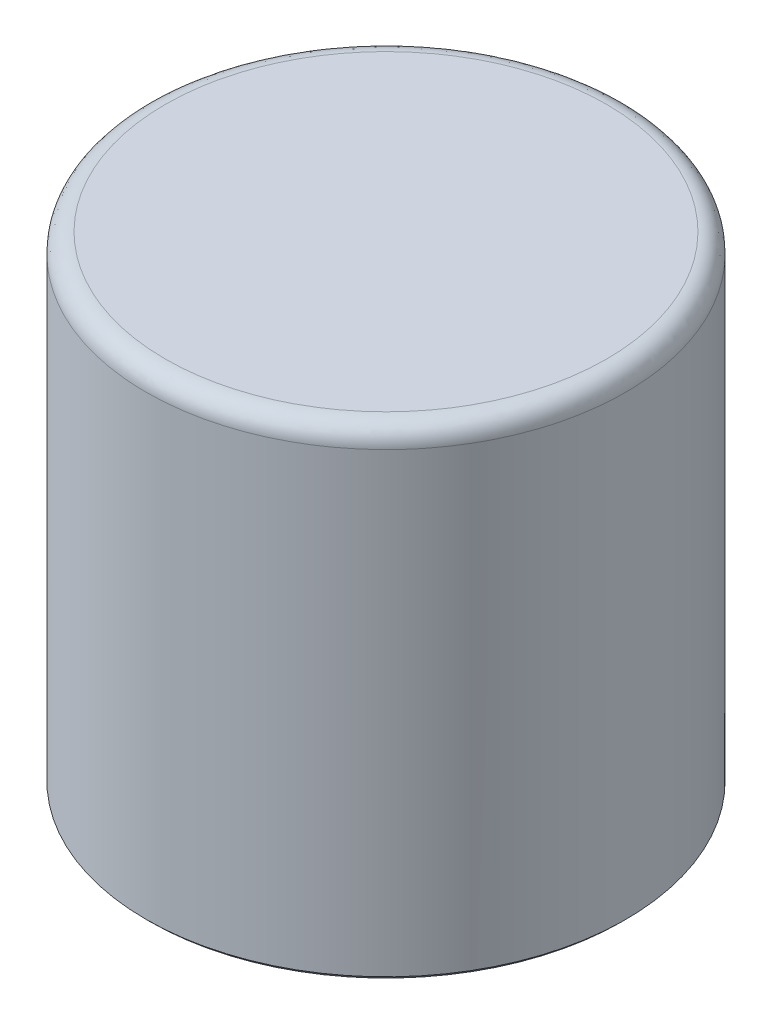
ISO-10303-21;
HEADER;
FILE_DESCRIPTION(('STEP AP214'),'2;1');
FILE_NAME('part.step','',(''),(''),'','','');
FILE_SCHEMA(('AUTOMOTIVE_DESIGN { 1 0 10303 214 1 1 1 1 }'));
ENDSEC;
DATA;
#1=APPLICATION_CONTEXT('core data for automotive mechanical design processes');
#2=APPLICATION_PROTOCOL_DEFINITION('international standard','automotive_design',2000,#1);
#3=PRODUCT_CONTEXT('',#1,'mechanical');
#4=PRODUCT('Part','Part','',(#3));
#5=PRODUCT_RELATED_PRODUCT_CATEGORY('part','',(#4));
#6=PRODUCT_DEFINITION_FORMATION('','',#4);
#7=PRODUCT_DEFINITION_CONTEXT('part definition',#1,'design');
#8=PRODUCT_DEFINITION('design','',#6,#7);
#9=PRODUCT_DEFINITION_SHAPE('','',#8);
#10=(LENGTH_UNIT() NAMED_UNIT(*) SI_UNIT(.MILLI.,.METRE.));
#11=(NAMED_UNIT(*) PLANE_ANGLE_UNIT() SI_UNIT($,.RADIAN.));
#12=(NAMED_UNIT(*) SI_UNIT($,.STERADIAN.) SOLID_ANGLE_UNIT());
#13=UNCERTAINTY_MEASURE_WITH_UNIT(LENGTH_MEASURE(1.E-05),#10,'distance_accuracy_value','');
#14=(GEOMETRIC_REPRESENTATION_CONTEXT(3) GLOBAL_UNCERTAINTY_ASSIGNED_CONTEXT((#13)) GLOBAL_UNIT_ASSIGNED_CONTEXT((#10,
#11,#12)) REPRESENTATION_CONTEXT('',''));
#15=CARTESIAN_POINT('',(0.,0.,0.));
#16=DIRECTION('',(0.,0.,1.));
#17=DIRECTION('',(1.,0.,0.));
#18=AXIS2_PLACEMENT_3D('',#15,#16,#17);
#19=CARTESIAN_POINT('',(0.,25.,0.));
#20=DIRECTION('',(0.,-1.,0.));
#21=DIRECTION('',(0.,0.,-1.));
#22=AXIS2_PLACEMENT_3D('',#19,#20,#21);
#23=CYLINDRICAL_SURFACE('',#22,12.5);
#24=CARTESIAN_POINT('',(0.,24.,12.5));
#25=CARTESIAN_POINT('',(0.818123085840602,24.,12.5));
#26=CARTESIAN_POINT('',(1.63622594505047,24.,12.419423901306));
#27=CARTESIAN_POINT('',(3.24103210535273,24.,12.1002081087748));
#28=CARTESIAN_POINT('',(4.02769573048032,24.,11.8615763069778));
#29=CARTESIAN_POINT('',(5.53939007864693,24.,11.2354120058044));
#30=CARTESIAN_POINT('',(6.26438342774463,24.,10.8478949872215));
#31=CARTESIAN_POINT('',(7.62487239774543,24.,9.93884532034213));
#32=CARTESIAN_POINT('',(8.2603343829883,24.,9.41733514667539));
#33=CARTESIAN_POINT('',(9.41733514667539,24.,8.2603343829883));
#34=CARTESIAN_POINT('',(9.93884532034219,24.,7.62487239774535));
#35=CARTESIAN_POINT('',(10.8478949872215,24.,6.2643834277447));
#36=CARTESIAN_POINT('',(11.2354120058041,24.,5.53939007864774));
#37=CARTESIAN_POINT('',(11.8615763069781,24.,4.0276957304795));
#38=CARTESIAN_POINT('',(12.1002081087748,24.,3.24103210535283));
#39=CARTESIAN_POINT('',(12.419423901306,24.,1.6362259450504));
#40=CARTESIAN_POINT('',(12.5,24.,0.818123085841312));
#41=CARTESIAN_POINT('',(12.5,24.,-0.81812308584131));
#42=CARTESIAN_POINT('',(12.419423901306,24.,-1.63622594505019));
#43=CARTESIAN_POINT('',(12.1002081087747,24.,-3.241032105353));
#44=CARTESIAN_POINT('',(11.8615763069778,24.,-4.02769573048025));
#45=CARTESIAN_POINT('',(11.2354120058044,24.,-5.539390078647));
#46=CARTESIAN_POINT('',(10.8478949872217,24.,-6.2643834277444));
#47=CARTESIAN_POINT('',(9.93884532034199,24.,-7.62487239774565));
#48=CARTESIAN_POINT('',(9.41733514667539,24.,-8.26033438298831));
#49=CARTESIAN_POINT('',(8.2603343829883,24.,-9.4173351466754));
#50=CARTESIAN_POINT('',(7.62487239774544,24.,-9.93884532034213));
#51=CARTESIAN_POINT('',(6.26438342774464,24.,-10.8478949872215));
#52=CARTESIAN_POINT('',(5.53939007864748,24.,-11.2354120058042));
#53=CARTESIAN_POINT('',(4.0276957304798,24.,-11.861576306978));
#54=CARTESIAN_POINT('',(3.24103210535286,24.,-12.1002081087748));
#55=CARTESIAN_POINT('',(1.63622594505037,24.,-12.419423901306));
#56=CARTESIAN_POINT('',(0.818123085841313,24.,-12.5));
#57=CARTESIAN_POINT('',(-0.81812308584131,24.,-12.5));
#58=CARTESIAN_POINT('',(-1.63622594505035,24.,-12.419423901306));
#59=CARTESIAN_POINT('',(-3.24103210535284,24.,-12.1002081087748));
#60=CARTESIAN_POINT('',(-4.02769573048005,24.,-11.8615763069779));
#61=CARTESIAN_POINT('',(-5.53939007864717,24.,-11.2354120058043));
#62=CARTESIAN_POINT('',(-6.26438342774485,24.,-10.8478949872214));
#63=CARTESIAN_POINT('',(-7.6248723977452,24.,-9.93884532034229));
#64=CARTESIAN_POINT('',(-8.26033438298863,24.,-9.41733514667506));
#65=CARTESIAN_POINT('',(-9.41733514667507,24.,-8.26033438298862));
#66=CARTESIAN_POINT('',(-9.93884532034227,24.,-7.62487239774522));
#67=CARTESIAN_POINT('',(-10.8478949872214,24.,-6.26438342774486));
#68=CARTESIAN_POINT('',(-11.2354120058042,24.,-5.5393900786473));
#69=CARTESIAN_POINT('',(-11.8615763069779,24.,-4.02769573047998));
#70=CARTESIAN_POINT('',(-12.1002081087748,24.,-3.24103210535291));
#71=CARTESIAN_POINT('',(-12.419423901306,24.,-1.63622594505033));
#72=CARTESIAN_POINT('',(-12.5,24.,-0.818123085841292));
#73=CARTESIAN_POINT('',(-12.5,24.,0.818123085841332));
#74=CARTESIAN_POINT('',(-12.419423901306,24.,1.6362259450503));
#75=CARTESIAN_POINT('',(-12.1002081087748,24.,3.24103210535289));
#76=CARTESIAN_POINT('',(-11.8615763069779,24.,4.02769573047994));
#77=CARTESIAN_POINT('',(-11.2354120058043,24.,5.53939007864727));
#78=CARTESIAN_POINT('',(-10.8478949872215,24.,6.26438342774462));
#79=CARTESIAN_POINT('',(-9.93884532034213,24.,7.62487239774544));
#80=CARTESIAN_POINT('',(-9.41733514667543,24.,8.26033438298826));
#81=CARTESIAN_POINT('',(-8.26033438298831,24.,9.41733514667538));
#82=CARTESIAN_POINT('',(-7.62487239774522,24.,9.93884532034227));
#83=CARTESIAN_POINT('',(-6.26438342774486,24.,10.8478949872213));
#84=CARTESIAN_POINT('',(-5.5393900786473,24.,11.2354120058042));
#85=CARTESIAN_POINT('',(-4.02769573047998,24.,11.8615763069779));
#86=CARTESIAN_POINT('',(-3.24103210535276,24.,12.1002081087748));
#87=CARTESIAN_POINT('',(-1.63622594505048,24.,12.419423901306));
#88=CARTESIAN_POINT('',(-0.818123085840603,24.,12.5));
#89=CARTESIAN_POINT('',(0.,24.,12.5));
#90=(BOUNDED_CURVE() B_SPLINE_CURVE(3,(#24,#25,#26,#27,#28,#29,#30,#31,#32,#33,#34,#35,#36,#37,
#38,#39,#40,#41,#42,#43,#44,#45,#46,#47,#48,#49,#50,#51,#52,#53,#54,#55,#56,#57,#58,#59,#60,#61,
#62,#63,#64,#65,#66,#67,#68,#69,#70,#71,#72,#73,#74,#75,#76,#77,#78,#79,#80,#81,#82,#83,#84,#85,
#86,#87,#88,#89),.UNSPECIFIED.,.T.,.F.) B_SPLINE_CURVE_WITH_KNOTS((4,2,2,2,2,2,2,2,2,2,2,2,2,2,
2,2,2,2,2,2,2,2,2,2,2,2,2,2,2,2,2,2,4),(0.,0.196349540849362,0.392699081698724,
0.589048622548086,0.785398163397448,0.98174770424681,1.17809724509617,1.37444678594553,
1.5707963267949,1.76714586764426,1.96349540849362,2.15984494934298,2.35619449019234,
2.55254403104171,2.74889357189107,2.94524311274043,3.14159265358979,3.33794219443916,
3.53429173528852,3.73064127613788,3.92699081698724,4.1233403578366,4.31968989868597,
4.51603943953533,4.71238898038469,4.90873852123405,5.10508806208341,5.30143760293278,
5.49778714378214,5.6941366846315,5.89048622548086,6.08683576633022,6.28318530717959),
.UNSPECIFIED.) CURVE() GEOMETRIC_REPRESENTATION_ITEM() RATIONAL_B_SPLINE_CURVE((1.,1.,1.,1.,1.,
1.,1.,1.,1.,1.,1.,1.,1.,1.,1.,1.,1.,1.,1.,1.,1.,1.,1.,1.,1.,1.,1.,1.,1.,1.,1.,1.,1.,1.,1.,1.,1.,
1.,1.,1.,1.,1.,1.,1.,1.,1.,1.,1.,1.,1.,1.,1.,1.,1.,1.,1.,1.,1.,1.,1.,1.,1.,1.,1.,1.,1.)) REPRESENTATION_ITEM(''));
#91=CARTESIAN_POINT('',(0.,24.,12.5));
#92=VERTEX_POINT('',#91);
#93=EDGE_CURVE('E11',#92,#92,#90,.F.);
#94=ORIENTED_EDGE('',*,*,#93,.T.);
#95=EDGE_LOOP('',(#94));
#96=FACE_BOUND('',#95,.T.);
#97=CARTESIAN_POINT('',(0.,0.200000000000006,0.));
#98=DIRECTION('',(0.,1.,0.));
#99=DIRECTION('',(0.,0.,1.));
#100=AXIS2_PLACEMENT_3D('',#97,#98,#99);
#101=CIRCLE('',#100,12.5);
#102=CARTESIAN_POINT('',(0.,0.200000000000006,12.5));
#103=VERTEX_POINT('',#102);
#104=EDGE_CURVE('E62',#103,#103,#101,.T.);
#105=ORIENTED_EDGE('',*,*,#104,.T.);
#106=EDGE_LOOP('',(#105));
#107=FACE_BOUND('',#106,.T.);
#108=ADVANCED_FACE('F42',(#96,#107),#23,.T.);
#109=CARTESIAN_POINT('',(0.,25.,0.));
#110=DIRECTION('',(0.,1.,0.));
#111=DIRECTION('',(0.,0.,1.));
#112=AXIS2_PLACEMENT_3D('',#109,#110,#111);
#113=PLANE('',#112);
#114=CARTESIAN_POINT('',(0.,25.,11.5));
#115=CARTESIAN_POINT('',(-0.752673238973355,25.,11.5));
#116=CARTESIAN_POINT('',(-1.5053278694464,25.,11.4258699892018));
#117=CARTESIAN_POINT('',(-2.98174953692458,25.,11.1321914600725));
#118=CARTESIAN_POINT('',(-3.70548007204161,25.,10.9126502024194));
#119=CARTESIAN_POINT('',(-5.09623887235549,25.,10.3365790453402));
#120=CARTESIAN_POINT('',(-5.76323275352507,25.,9.98006338824393));
#121=CARTESIAN_POINT('',(-7.0148826059258,25.,9.1437376947146));
#122=CARTESIAN_POINT('',(-7.59950763234929,25.,8.66394833494131));
#123=CARTESIAN_POINT('',(-8.66394833494136,25.,7.59950763234924));
#124=CARTESIAN_POINT('',(-9.14373769471526,25.,7.01488260592579));
#125=CARTESIAN_POINT('',(-9.98006338824329,25.,5.76323275352506));
#126=CARTESIAN_POINT('',(-10.3365790453402,25.,5.09623887235546));
#127=CARTESIAN_POINT('',(-10.9126502024194,25.,3.70548007204157));
#128=CARTESIAN_POINT('',(-11.1321914600725,25.,2.98174953692456));
#129=CARTESIAN_POINT('',(-11.4258699892018,25.,1.50532786944637));
#130=CARTESIAN_POINT('',(-11.5,25.,0.752673238974025));
#131=CARTESIAN_POINT('',(-11.5,25.,-0.752673238973989));
#132=CARTESIAN_POINT('',(-11.4258699892018,25.,-1.50532786944623));
#133=CARTESIAN_POINT('',(-11.1321914600725,25.,-2.98174953692475));
#134=CARTESIAN_POINT('',(-10.9126502024194,25.,-3.7054800720416));
#135=CARTESIAN_POINT('',(-10.3365790453402,25.,-5.09623887235549));
#136=CARTESIAN_POINT('',(-9.98006338824393,25.,-5.76323275352507));
#137=CARTESIAN_POINT('',(-9.1437376947146,25.,-7.0148826059258));
#138=CARTESIAN_POINT('',(-8.66394833494123,25.,-7.59950763234936));
#139=CARTESIAN_POINT('',(-7.59950763234937,25.,-8.66394833494122));
#140=CARTESIAN_POINT('',(-7.01488260592553,25.,-9.14373769471479));
#141=CARTESIAN_POINT('',(-5.76323275352531,25.,-9.98006338824377));
#142=CARTESIAN_POINT('',(-5.09623887235517,25.,-10.3365790453397));
#143=CARTESIAN_POINT('',(-3.70548007204186,25.,-10.9126502024199));
#144=CARTESIAN_POINT('',(-2.98174953692454,25.,-11.1321914600733));
#145=CARTESIAN_POINT('',(-1.50532786944639,25.,-11.425869989201));
#146=CARTESIAN_POINT('',(-0.752673238974006,25.,-11.5));
#147=CARTESIAN_POINT('',(0.752673238974008,25.,-11.5));
#148=CARTESIAN_POINT('',(1.50532786944641,25.,-11.4258699892017));
#149=CARTESIAN_POINT('',(2.98174953692456,25.,-11.1321914600726));
#150=CARTESIAN_POINT('',(3.70548007204157,25.,-10.9126502024199));
#151=CARTESIAN_POINT('',(5.09623887235553,25.,-10.3365790453397));
#152=CARTESIAN_POINT('',(5.76323275352533,25.,-9.98006338824376));
#153=CARTESIAN_POINT('',(7.01488260592555,25.,-9.14373769471478));
#154=CARTESIAN_POINT('',(7.59950763234871,25.,-8.66394833494124));
#155=CARTESIAN_POINT('',(8.66394833494188,25.,-7.59950763234938));
#156=CARTESIAN_POINT('',(9.14373769471479,25.,-7.01488260592618));
#157=CARTESIAN_POINT('',(9.98006338824377,25.,-5.76323275352466));
#158=CARTESIAN_POINT('',(10.3365790453403,25.,-5.09623887235552));
#159=CARTESIAN_POINT('',(10.9126502024193,25.,-3.70548007204155));
#160=CARTESIAN_POINT('',(11.1321914600733,25.,-2.98174953692471));
#161=CARTESIAN_POINT('',(11.425869989201,25.,-1.50532786944623));
#162=CARTESIAN_POINT('',(11.5,25.,-0.752673238974005));
#163=CARTESIAN_POINT('',(11.5,25.,0.752673238974007));
#164=CARTESIAN_POINT('',(11.4258699892023,25.,1.50532786944657));
#165=CARTESIAN_POINT('',(11.132191460072,25.,2.9817495369244));
#166=CARTESIAN_POINT('',(10.9126502024206,25.,3.70548007204122));
#167=CARTESIAN_POINT('',(10.336579045339,25.,5.09623887235584));
#168=CARTESIAN_POINT('',(9.98006338824311,25.,5.76323275352499));
#169=CARTESIAN_POINT('',(9.14373769471544,25.,7.01488260592586));
#170=CARTESIAN_POINT('',(8.66394833494123,25.,7.59950763234937));
#171=CARTESIAN_POINT('',(7.59950763234937,25.,8.66394833494123));
#172=CARTESIAN_POINT('',(7.01488260592587,25.,9.14373769471478));
#173=CARTESIAN_POINT('',(5.76323275352499,25.,9.98006338824376));
#174=CARTESIAN_POINT('',(5.09623887235564,25.,10.3365790453401));
#175=CARTESIAN_POINT('',(3.70548007204143,25.,10.9126502024195));
#176=CARTESIAN_POINT('',(2.98174953692453,25.,11.1321914600725));
#177=CARTESIAN_POINT('',(1.50532786944642,25.,11.4258699892018));
#178=CARTESIAN_POINT('',(0.752673238973354,25.,11.5));
#179=CARTESIAN_POINT('',(0.,25.,11.5));
#180=(BOUNDED_CURVE() B_SPLINE_CURVE(3,(#114,#115,#116,#117,#118,#119,#120,#121,#122,#123,#124,
#125,#126,#127,#128,#129,#130,#131,#132,#133,#134,#135,#136,#137,#138,#139,#140,#141,#142,#143,
#144,#145,#146,#147,#148,#149,#150,#151,#152,#153,#154,#155,#156,#157,#158,#159,#160,#161,#162,
#163,#164,#165,#166,#167,#168,#169,#170,#171,#172,#173,#174,#175,#176,#177,#178,#179),
.UNSPECIFIED.,.T.,.F.) B_SPLINE_CURVE_WITH_KNOTS((4,2,2,2,2,2,2,2,2,2,2,2,2,2,2,2,2,2,2,2,2,2,2,
2,2,2,2,2,2,2,2,2,4),(0.,0.196349540849362,0.392699081698725,0.589048622548086,
0.785398163397448,0.981747704246811,1.17809724509617,1.37444678594553,1.5707963267949,
1.76714586764426,1.96349540849362,2.15984494934298,2.35619449019234,2.55254403104171,
2.74889357189107,2.94524311274043,3.14159265358979,3.33794219443916,3.53429173528852,
3.73064127613788,3.92699081698724,4.1233403578366,4.31968989868597,4.51603943953533,
4.71238898038469,4.90873852123405,5.10508806208341,5.30143760293278,5.49778714378214,
5.6941366846315,5.89048622548086,6.08683576633022,6.28318530717959),
.UNSPECIFIED.) CURVE() GEOMETRIC_REPRESENTATION_ITEM() RATIONAL_B_SPLINE_CURVE((1.,1.,1.,1.,1.,
1.,1.,1.,1.,1.,1.,1.,1.,1.,1.,1.,1.,1.,1.,1.,1.,1.,1.,1.,1.,1.,1.,1.,1.,1.,1.,1.,1.,1.,1.,1.,1.,
1.,1.,1.,1.,1.,1.,1.,1.,1.,1.,1.,1.,1.,1.,1.,1.,1.,1.,1.,1.,1.,1.,1.,1.,1.,1.,1.,1.,1.)) REPRESENTATION_ITEM(''));
#181=CARTESIAN_POINT('',(0.,25.,11.5));
#182=VERTEX_POINT('',#181);
#183=EDGE_CURVE('E56',#182,#182,#180,.F.);
#184=ORIENTED_EDGE('',*,*,#183,.T.);
#185=EDGE_LOOP('',(#184));
#186=FACE_BOUND('',#185,.T.);
#187=ADVANCED_FACE('F82',(#186),#113,.T.);
#188=CARTESIAN_POINT('',(0.,0.,0.));
#189=DIRECTION('',(0.,1.,0.));
#190=DIRECTION('',(0.,0.,1.));
#191=AXIS2_PLACEMENT_3D('',#188,#189,#190);
#192=PLANE('',#191);
#193=CARTESIAN_POINT('',(0.,0.,0.));
#194=DIRECTION('',(0.,1.,0.));
#195=DIRECTION('',(0.,0.,1.));
#196=AXIS2_PLACEMENT_3D('',#193,#194,#195);
#197=CIRCLE('',#196,10.2);
#198=CARTESIAN_POINT('',(0.,0.,10.2));
#199=VERTEX_POINT('',#198);
#200=EDGE_CURVE('E68',#199,#199,#197,.T.);
#201=ORIENTED_EDGE('',*,*,#200,.T.);
#202=EDGE_LOOP('',(#201));
#203=FACE_BOUND('',#202,.T.);
#204=CARTESIAN_POINT('',(0.,0.,0.));
#205=DIRECTION('',(0.,1.,0.));
#206=DIRECTION('',(0.,0.,1.));
#207=AXIS2_PLACEMENT_3D('',#204,#205,#206);
#208=CIRCLE('',#207,12.3);
#209=CARTESIAN_POINT('',(0.,0.,12.3));
#210=VERTEX_POINT('',#209);
#211=EDGE_CURVE('E74',#210,#210,#208,.F.);
#212=ORIENTED_EDGE('',*,*,#211,.T.);
#213=EDGE_LOOP('',(#212));
#214=FACE_BOUND('',#213,.T.);
#215=ADVANCED_FACE('F92',(#203,#214),#192,.F.);
#216=CARTESIAN_POINT('',(0.,5.,0.));
#217=DIRECTION('',(0.,-1.,0.));
#218=DIRECTION('',(0.,0.,-1.));
#219=AXIS2_PLACEMENT_3D('',#216,#217,#218);
#220=CYLINDRICAL_SURFACE('',#219,10.);
#221=CARTESIAN_POINT('',(0.,0.199999999999997,0.));
#222=DIRECTION('',(0.,1.,0.));
#223=DIRECTION('',(0.,0.,1.));
#224=AXIS2_PLACEMENT_3D('',#221,#222,#223);
#225=CIRCLE('',#224,10.);
#226=CARTESIAN_POINT('',(0.,0.199999999999997,10.));
#227=VERTEX_POINT('',#226);
#228=EDGE_CURVE('E137',#227,#227,#225,.F.);
#229=ORIENTED_EDGE('',*,*,#228,.T.);
#230=EDGE_LOOP('',(#229));
#231=FACE_BOUND('',#230,.T.);
#232=CARTESIAN_POINT('',(0.,5.,0.));
#233=DIRECTION('',(0.,-1.,0.));
#234=DIRECTION('',(0.,0.,-1.));
#235=AXIS2_PLACEMENT_3D('',#232,#233,#234);
#236=CIRCLE('',#235,10.);
#237=CARTESIAN_POINT('',(0.,5.,-10.));
#238=VERTEX_POINT('',#237);
#239=EDGE_CURVE('E150',#238,#238,#236,.T.);
#240=ORIENTED_EDGE('',*,*,#239,.F.);
#241=EDGE_LOOP('',(#240));
#242=FACE_BOUND('',#241,.T.);
#243=ADVANCED_FACE('F93',(#231,#242),#220,.F.);
#244=CARTESIAN_POINT('',(0.,5.,0.));
#245=DIRECTION('',(0.,-1.,0.));
#246=DIRECTION('',(0.,0.,-1.));
#247=AXIS2_PLACEMENT_3D('',#244,#245,#246);
#248=PLANE('',#247);
#249=CARTESIAN_POINT('',(0.,5.,0.));
#250=DIRECTION('',(0.,-1.,0.));
#251=DIRECTION('',(0.,0.,-1.));
#252=AXIS2_PLACEMENT_3D('',#249,#250,#251);
#253=CIRCLE('',#252,3.2);
#254=CARTESIAN_POINT('',(0.,5.,-3.2));
#255=VERTEX_POINT('',#254);
#256=EDGE_CURVE('E140',#255,#255,#253,.F.);
#257=ORIENTED_EDGE('',*,*,#256,.T.);
#258=EDGE_LOOP('',(#257));
#259=FACE_BOUND('',#258,.T.);
#260=ORIENTED_EDGE('',*,*,#239,.T.);
#261=EDGE_LOOP('',(#260));
#262=FACE_BOUND('',#261,.T.);
#263=ADVANCED_FACE('F163',(#259,#262),#248,.T.);
#264=CARTESIAN_POINT('',(0.,20.,0.));
#265=DIRECTION('',(0.,-1.,0.));
#266=DIRECTION('',(0.,0.,-1.));
#267=AXIS2_PLACEMENT_3D('',#264,#265,#266);
#268=CYLINDRICAL_SURFACE('',#267,3.);
#269=CARTESIAN_POINT('',(0.,5.19999999999999,0.));
#270=DIRECTION('',(0.,-1.,0.));
#271=DIRECTION('',(0.,0.,-1.));
#272=AXIS2_PLACEMENT_3D('',#269,#270,#271);
#273=CIRCLE('',#272,3.);
#274=CARTESIAN_POINT('',(0.,5.19999999999999,-3.));
#275=VERTEX_POINT('',#274);
#276=EDGE_CURVE('E146',#275,#275,#273,.T.);
#277=ORIENTED_EDGE('',*,*,#276,.T.);
#278=EDGE_LOOP('',(#277));
#279=FACE_BOUND('',#278,.T.);
#280=CARTESIAN_POINT('',(0.,20.,0.));
#281=DIRECTION('',(0.,-1.,0.));
#282=DIRECTION('',(0.,0.,-1.));
#283=AXIS2_PLACEMENT_3D('',#280,#281,#282);
#284=CIRCLE('',#283,3.);
#285=CARTESIAN_POINT('',(0.,20.,-3.));
#286=VERTEX_POINT('',#285);
#287=EDGE_CURVE('E154',#286,#286,#284,.T.);
#288=ORIENTED_EDGE('',*,*,#287,.F.);
#289=EDGE_LOOP('',(#288));
#290=FACE_BOUND('',#289,.T.);
#291=ADVANCED_FACE('F161',(#279,#290),#268,.F.);
#292=CARTESIAN_POINT('',(0.,20.,0.));
#293=DIRECTION('',(0.,-1.,0.));
#294=DIRECTION('',(0.,0.,-1.));
#295=AXIS2_PLACEMENT_3D('',#292,#293,#294);
#296=PLANE('',#295);
#297=ORIENTED_EDGE('',*,*,#287,.T.);
#298=EDGE_LOOP('',(#297));
#299=FACE_BOUND('',#298,.T.);
#300=ADVANCED_FACE('F159',(#299),#296,.T.);
#301=CARTESIAN_POINT('',(0.,5.19999999999999,0.));
#302=DIRECTION('',(0.,-1.,0.));
#303=DIRECTION('',(0.,0.,-1.));
#304=AXIS2_PLACEMENT_3D('',#301,#302,#303);
#305=CONICAL_SURFACE('',#304,3.,0.785398163397462);
#306=ORIENTED_EDGE('',*,*,#256,.F.);
#307=EDGE_LOOP('',(#306));
#308=FACE_BOUND('',#307,.T.);
#309=ORIENTED_EDGE('',*,*,#276,.F.);
#310=EDGE_LOOP('',(#309));
#311=FACE_BOUND('',#310,.T.);
#312=ADVANCED_FACE('F101',(#308,#311),#305,.F.);
#313=CARTESIAN_POINT('',(0.,0.199999999999997,0.));
#314=DIRECTION('',(0.,-1.,0.));
#315=DIRECTION('',(0.,0.,-1.));
#316=AXIS2_PLACEMENT_3D('',#313,#314,#315);
#317=CONICAL_SURFACE('',#316,10.,0.785398163397448);
#318=ORIENTED_EDGE('',*,*,#200,.F.);
#319=EDGE_LOOP('',(#318));
#320=FACE_BOUND('',#319,.T.);
#321=ORIENTED_EDGE('',*,*,#228,.F.);
#322=EDGE_LOOP('',(#321));
#323=FACE_BOUND('',#322,.T.);
#324=ADVANCED_FACE('F126',(#320,#323),#317,.F.);
#325=CARTESIAN_POINT('',(0.,0.200000000000006,0.));
#326=DIRECTION('',(0.,1.,0.));
#327=DIRECTION('',(0.,0.,1.));
#328=AXIS2_PLACEMENT_3D('',#325,#326,#327);
#329=CONICAL_SURFACE('',#328,12.5,0.785398163397453);
#330=ORIENTED_EDGE('',*,*,#211,.F.);
#331=EDGE_LOOP('',(#330));
#332=FACE_BOUND('',#331,.T.);
#333=ORIENTED_EDGE('',*,*,#104,.F.);
#334=EDGE_LOOP('',(#333));
#335=FACE_BOUND('',#334,.T.);
#336=ADVANCED_FACE('F122',(#332,#335),#329,.T.);
#337=CARTESIAN_POINT('',(0.,25.,11.5));
#338=CARTESIAN_POINT('',(0.752673238973354,25.,11.5));
#339=CARTESIAN_POINT('',(1.50532786944642,25.,11.4258699892018));
#340=CARTESIAN_POINT('',(2.98174953692453,25.,11.1321914600725));
#341=CARTESIAN_POINT('',(3.70548007204143,25.,10.9126502024195));
#342=CARTESIAN_POINT('',(5.09623887235564,25.,10.3365790453401));
#343=CARTESIAN_POINT('',(5.76323275352499,25.,9.98006338824376));
#344=CARTESIAN_POINT('',(7.01488260592587,25.,9.14373769471478));
#345=CARTESIAN_POINT('',(7.59950763234937,25.,8.66394833494123));
#346=CARTESIAN_POINT('',(8.66394833494123,25.,7.59950763234937));
#347=CARTESIAN_POINT('',(9.14373769471544,25.,7.01488260592586));
#348=CARTESIAN_POINT('',(9.98006338824311,25.,5.76323275352499));
#349=CARTESIAN_POINT('',(10.336579045339,25.,5.09623887235584));
#350=CARTESIAN_POINT('',(10.9126502024206,25.,3.70548007204122));
#351=CARTESIAN_POINT('',(11.132191460072,25.,2.9817495369244));
#352=CARTESIAN_POINT('',(11.4258699892023,25.,1.50532786944657));
#353=CARTESIAN_POINT('',(11.5,25.,0.752673238974007));
#354=CARTESIAN_POINT('',(11.5,25.,-0.752673238974005));
#355=CARTESIAN_POINT('',(11.425869989201,25.,-1.50532786944623));
#356=CARTESIAN_POINT('',(11.1321914600733,25.,-2.98174953692471));
#357=CARTESIAN_POINT('',(10.9126502024193,25.,-3.70548007204155));
#358=CARTESIAN_POINT('',(10.3365790453403,25.,-5.09623887235552));
#359=CARTESIAN_POINT('',(9.98006338824377,25.,-5.76323275352466));
#360=CARTESIAN_POINT('',(9.14373769471479,25.,-7.01488260592618));
#361=CARTESIAN_POINT('',(8.66394833494188,25.,-7.59950763234938));
#362=CARTESIAN_POINT('',(7.59950763234871,25.,-8.66394833494124));
#363=CARTESIAN_POINT('',(7.01488260592555,25.,-9.14373769471478));
#364=CARTESIAN_POINT('',(5.76323275352533,25.,-9.98006338824376));
#365=CARTESIAN_POINT('',(5.09623887235553,25.,-10.3365790453397));
#366=CARTESIAN_POINT('',(3.70548007204157,25.,-10.9126502024199));
#367=CARTESIAN_POINT('',(2.98174953692456,25.,-11.1321914600726));
#368=CARTESIAN_POINT('',(1.50532786944641,25.,-11.4258699892017));
#369=CARTESIAN_POINT('',(0.752673238974008,25.,-11.5));
#370=CARTESIAN_POINT('',(-0.752673238974006,25.,-11.5));
#371=CARTESIAN_POINT('',(-1.50532786944639,25.,-11.425869989201));
#372=CARTESIAN_POINT('',(-2.98174953692454,25.,-11.1321914600733));
#373=CARTESIAN_POINT('',(-3.70548007204186,25.,-10.9126502024199));
#374=CARTESIAN_POINT('',(-5.09623887235517,25.,-10.3365790453397));
#375=CARTESIAN_POINT('',(-5.76323275352531,25.,-9.98006338824377));
#376=CARTESIAN_POINT('',(-7.01488260592553,25.,-9.14373769471479));
#377=CARTESIAN_POINT('',(-7.59950763234937,25.,-8.66394833494122));
#378=CARTESIAN_POINT('',(-8.66394833494123,25.,-7.59950763234936));
#379=CARTESIAN_POINT('',(-9.1437376947146,25.,-7.0148826059258));
#380=CARTESIAN_POINT('',(-9.98006338824393,25.,-5.76323275352507));
#381=CARTESIAN_POINT('',(-10.3365790453402,25.,-5.09623887235549));
#382=CARTESIAN_POINT('',(-10.9126502024194,25.,-3.7054800720416));
#383=CARTESIAN_POINT('',(-11.1321914600725,25.,-2.98174953692475));
#384=CARTESIAN_POINT('',(-11.4258699892018,25.,-1.50532786944623));
#385=CARTESIAN_POINT('',(-11.5,25.,-0.752673238973989));
#386=CARTESIAN_POINT('',(-11.5,25.,0.752673238974025));
#387=CARTESIAN_POINT('',(-11.4258699892018,25.,1.50532786944637));
#388=CARTESIAN_POINT('',(-11.1321914600725,25.,2.98174953692456));
#389=CARTESIAN_POINT('',(-10.9126502024194,25.,3.70548007204157));
#390=CARTESIAN_POINT('',(-10.3365790453402,25.,5.09623887235546));
#391=CARTESIAN_POINT('',(-9.98006338824329,25.,5.76323275352506));
#392=CARTESIAN_POINT('',(-9.14373769471526,25.,7.01488260592579));
#393=CARTESIAN_POINT('',(-8.66394833494136,25.,7.59950763234924));
#394=CARTESIAN_POINT('',(-7.59950763234929,25.,8.66394833494131));
#395=CARTESIAN_POINT('',(-7.0148826059258,25.,9.1437376947146));
#396=CARTESIAN_POINT('',(-5.76323275352507,25.,9.98006338824393));
#397=CARTESIAN_POINT('',(-5.09623887235549,25.,10.3365790453402));
#398=CARTESIAN_POINT('',(-3.70548007204161,25.,10.9126502024194));
#399=CARTESIAN_POINT('',(-2.98174953692458,25.,11.1321914600725));
#400=CARTESIAN_POINT('',(-1.5053278694464,25.,11.4258699892018));
#401=CARTESIAN_POINT('',(-0.752673238973355,25.,11.5));
#402=CARTESIAN_POINT('',(0.,25.,11.5));
#403=CARTESIAN_POINT('',(0.,25.,12.5));
#404=CARTESIAN_POINT('',(0.818123085840602,25.,12.5));
#405=CARTESIAN_POINT('',(1.63622594505036,24.9999999999987,12.4194239013062));
#406=CARTESIAN_POINT('',(3.24103210535285,25.0000000000013,12.1002081087746));
#407=CARTESIAN_POINT('',(4.0276957304801,25.,11.8615763069772));
#408=CARTESIAN_POINT('',(5.53939007864715,25.,11.2354120058049));
#409=CARTESIAN_POINT('',(6.26438342774472,25.,10.8478949872216));
#410=CARTESIAN_POINT('',(7.62487239774535,25.,9.93884532034201));
#411=CARTESIAN_POINT('',(8.26033438298831,25.,9.41733514667539));
#412=CARTESIAN_POINT('',(9.41733514667539,25.,8.26033438298831));
#413=CARTESIAN_POINT('',(9.93884532034267,25.,7.62487239774567));
#414=CARTESIAN_POINT('',(10.847894987221,25.,6.26438342774438));
#415=CARTESIAN_POINT('',(11.2354120058038,25.,5.53939007864731));
#416=CARTESIAN_POINT('',(11.8615763069784,25.,4.02769573047993));
#417=CARTESIAN_POINT('',(12.100208108774,24.9999999999987,3.24103210535251));
#418=CARTESIAN_POINT('',(12.4194239013067,25.0000000000013,1.63622594505071));
#419=CARTESIAN_POINT('',(12.5,25.,0.818123085841312));
#420=CARTESIAN_POINT('',(12.5,25.,-0.81812308584131));
#421=CARTESIAN_POINT('',(12.4194239013061,24.9999999999987,-1.63622594505004));
#422=CARTESIAN_POINT('',(12.1002081087747,25.0000000000013,-3.24103210535315));
#423=CARTESIAN_POINT('',(11.861576306977,25.,-4.02769573047961));
#424=CARTESIAN_POINT('',(11.2354120058051,25.,-5.53939007864765));
#425=CARTESIAN_POINT('',(10.8478949872216,25.,-6.26438342774438));
#426=CARTESIAN_POINT('',(9.93884532034202,25.,-7.62487239774567));
#427=CARTESIAN_POINT('',(9.41733514667604,25.,-8.26033438298897));
#428=CARTESIAN_POINT('',(8.26033438298764,25.,-9.41733514667475));
#429=CARTESIAN_POINT('',(7.62487239774536,25.,-9.93884532034201));
#430=CARTESIAN_POINT('',(6.26438342774472,25.,-10.8478949872216));
#431=CARTESIAN_POINT('',(5.53939007864701,25.,-11.2354120058038));
#432=CARTESIAN_POINT('',(4.02769573048028,25.,-11.8615763069783));
#433=CARTESIAN_POINT('',(3.24103210535268,24.9999999999987,-12.1002081087747));
#434=CARTESIAN_POINT('',(1.63622594505055,25.0000000000013,-12.4194239013061));
#435=CARTESIAN_POINT('',(0.818123085841314,25.,-12.5));
#436=CARTESIAN_POINT('',(-0.818123085841311,25.,-12.5));
#437=CARTESIAN_POINT('',(-1.63622594505021,24.9999999999987,-12.4194239013061));
#438=CARTESIAN_POINT('',(-3.24103210535298,25.0000000000013,-12.1002081087747));
#439=CARTESIAN_POINT('',(-4.02769573048057,25.,-11.8615763069784));
#440=CARTESIAN_POINT('',(-5.53939007864665,25.,-11.2354120058038));
#441=CARTESIAN_POINT('',(-6.26438342774503,25.,-10.8478949872216));
#442=CARTESIAN_POINT('',(-7.62487239774502,25.,-9.93884532034202));
#443=CARTESIAN_POINT('',(-8.26033438298896,25.,-9.41733514667539));
#444=CARTESIAN_POINT('',(-9.41733514667475,25.,-8.2603343829883));
#445=CARTESIAN_POINT('',(-9.9388453203423,25.,-7.62487239774524));
#446=CARTESIAN_POINT('',(-10.8478949872213,25.,-6.26438342774484));
#447=CARTESIAN_POINT('',(-11.2354120058042,25.,-5.53939007864727));
#448=CARTESIAN_POINT('',(-11.861576306978,25.,-4.02769573048));
#449=CARTESIAN_POINT('',(-12.1002081087745,24.9999999999987,-3.2410321053527));
#450=CARTESIAN_POINT('',(-12.4194239013063,25.0000000000013,-1.63622594505054));
#451=CARTESIAN_POINT('',(-12.5,25.,-0.818123085841292));
#452=CARTESIAN_POINT('',(-12.5,25.,0.818123085841332));
#453=CARTESIAN_POINT('',(-12.4194239013063,24.9999999999987,1.63622594505019));
#454=CARTESIAN_POINT('',(-12.1002081087745,25.0000000000013,3.241032105353));
#455=CARTESIAN_POINT('',(-11.861576306978,25.,4.02769573047997));
#456=CARTESIAN_POINT('',(-11.2354120058042,25.,5.53939007864724));
#457=CARTESIAN_POINT('',(-10.8478949872207,25.,6.26438342774483));
#458=CARTESIAN_POINT('',(-9.93884532034296,25.,7.62487239774523));
#459=CARTESIAN_POINT('',(-9.41733514667511,25.,8.26033438298793));
#460=CARTESIAN_POINT('',(-8.26033438298864,25.,9.41733514667571));
#461=CARTESIAN_POINT('',(-7.62487239774524,25.,9.9388453203423));
#462=CARTESIAN_POINT('',(-6.26438342774484,25.,10.8478949872213));
#463=CARTESIAN_POINT('',(-5.53939007864695,25.,11.2354120058042));
#464=CARTESIAN_POINT('',(-4.02769573048033,25.,11.861576306978));
#465=CARTESIAN_POINT('',(-3.24103210535254,24.9999999999987,12.1002081087745));
#466=CARTESIAN_POINT('',(-1.6362259450507,25.0000000000013,12.4194239013063));
#467=CARTESIAN_POINT('',(-0.818123085840603,25.,12.5));
#468=CARTESIAN_POINT('',(0.,25.,12.5));
#469=CARTESIAN_POINT('',(0.,24.,12.5));
#470=CARTESIAN_POINT('',(0.818123085840602,24.,12.5));
#471=CARTESIAN_POINT('',(1.63622594505047,24.,12.419423901306));
#472=CARTESIAN_POINT('',(3.24103210535273,24.,12.1002081087748));
#473=CARTESIAN_POINT('',(4.02769573048032,24.,11.8615763069778));
#474=CARTESIAN_POINT('',(5.53939007864693,24.,11.2354120058044));
#475=CARTESIAN_POINT('',(6.26438342774463,24.,10.8478949872215));
#476=CARTESIAN_POINT('',(7.62487239774543,24.,9.93884532034213));
#477=CARTESIAN_POINT('',(8.2603343829883,24.,9.41733514667539));
#478=CARTESIAN_POINT('',(9.41733514667539,24.,8.2603343829883));
#479=CARTESIAN_POINT('',(9.93884532034219,24.,7.62487239774535));
#480=CARTESIAN_POINT('',(10.8478949872215,24.,6.2643834277447));
#481=CARTESIAN_POINT('',(11.2354120058041,24.,5.53939007864774));
#482=CARTESIAN_POINT('',(11.8615763069781,24.,4.0276957304795));
#483=CARTESIAN_POINT('',(12.1002081087748,24.,3.24103210535283));
#484=CARTESIAN_POINT('',(12.419423901306,24.,1.6362259450504));
#485=CARTESIAN_POINT('',(12.5,24.,0.818123085841312));
#486=CARTESIAN_POINT('',(12.5,24.,-0.81812308584131));
#487=CARTESIAN_POINT('',(12.419423901306,24.,-1.63622594505019));
#488=CARTESIAN_POINT('',(12.1002081087747,24.,-3.241032105353));
#489=CARTESIAN_POINT('',(11.8615763069778,24.,-4.02769573048025));
#490=CARTESIAN_POINT('',(11.2354120058044,24.,-5.539390078647));
#491=CARTESIAN_POINT('',(10.8478949872217,24.,-6.2643834277444));
#492=CARTESIAN_POINT('',(9.93884532034199,24.,-7.62487239774565));
#493=CARTESIAN_POINT('',(9.41733514667539,24.,-8.26033438298831));
#494=CARTESIAN_POINT('',(8.2603343829883,24.,-9.4173351466754));
#495=CARTESIAN_POINT('',(7.62487239774544,24.,-9.93884532034213));
#496=CARTESIAN_POINT('',(6.26438342774464,24.,-10.8478949872215));
#497=CARTESIAN_POINT('',(5.53939007864748,24.,-11.2354120058042));
#498=CARTESIAN_POINT('',(4.0276957304798,24.,-11.861576306978));
#499=CARTESIAN_POINT('',(3.24103210535286,24.,-12.1002081087748));
#500=CARTESIAN_POINT('',(1.63622594505037,24.,-12.419423901306));
#501=CARTESIAN_POINT('',(0.818123085841313,24.,-12.5));
#502=CARTESIAN_POINT('',(-0.81812308584131,24.,-12.5));
#503=CARTESIAN_POINT('',(-1.63622594505035,24.,-12.419423901306));
#504=CARTESIAN_POINT('',(-3.24103210535284,24.,-12.1002081087748));
#505=CARTESIAN_POINT('',(-4.02769573048005,24.,-11.8615763069779));
#506=CARTESIAN_POINT('',(-5.53939007864717,24.,-11.2354120058043));
#507=CARTESIAN_POINT('',(-6.26438342774485,24.,-10.8478949872214));
#508=CARTESIAN_POINT('',(-7.6248723977452,24.,-9.93884532034229));
#509=CARTESIAN_POINT('',(-8.26033438298863,24.,-9.41733514667506));
#510=CARTESIAN_POINT('',(-9.41733514667507,24.,-8.26033438298862));
#511=CARTESIAN_POINT('',(-9.93884532034227,24.,-7.62487239774522));
#512=CARTESIAN_POINT('',(-10.8478949872214,24.,-6.26438342774486));
#513=CARTESIAN_POINT('',(-11.2354120058042,24.,-5.5393900786473));
#514=CARTESIAN_POINT('',(-11.8615763069779,24.,-4.02769573047998));
#515=CARTESIAN_POINT('',(-12.1002081087748,24.,-3.24103210535291));
#516=CARTESIAN_POINT('',(-12.419423901306,24.,-1.63622594505033));
#517=CARTESIAN_POINT('',(-12.5,24.,-0.818123085841292));
#518=CARTESIAN_POINT('',(-12.5,24.,0.818123085841332));
#519=CARTESIAN_POINT('',(-12.419423901306,24.,1.6362259450503));
#520=CARTESIAN_POINT('',(-12.1002081087748,24.,3.24103210535289));
#521=CARTESIAN_POINT('',(-11.8615763069779,24.,4.02769573047994));
#522=CARTESIAN_POINT('',(-11.2354120058043,24.,5.53939007864727));
#523=CARTESIAN_POINT('',(-10.8478949872215,24.,6.26438342774462));
#524=CARTESIAN_POINT('',(-9.93884532034213,24.,7.62487239774544));
#525=CARTESIAN_POINT('',(-9.41733514667543,24.,8.26033438298826));
#526=CARTESIAN_POINT('',(-8.26033438298831,24.,9.41733514667538));
#527=CARTESIAN_POINT('',(-7.62487239774522,24.,9.93884532034227));
#528=CARTESIAN_POINT('',(-6.26438342774486,24.,10.8478949872213));
#529=CARTESIAN_POINT('',(-5.5393900786473,24.,11.2354120058042));
#530=CARTESIAN_POINT('',(-4.02769573047998,24.,11.8615763069779));
#531=CARTESIAN_POINT('',(-3.24103210535276,24.,12.1002081087748));
#532=CARTESIAN_POINT('',(-1.63622594505048,24.,12.419423901306));
#533=CARTESIAN_POINT('',(-0.818123085840603,24.,12.5));
#534=CARTESIAN_POINT('',(0.,24.,12.5));
#535=(BOUNDED_SURFACE() B_SPLINE_SURFACE(2,3,((#337,#338,#339,#340,#341,#342,#343,#344,#345,
#346,#347,#348,#349,#350,#351,#352,#353,#354,#355,#356,#357,#358,#359,#360,#361,#362,#363,#364,
#365,#366,#367,#368,#369,#370,#371,#372,#373,#374,#375,#376,#377,#378,#379,#380,#381,#382,#383,
#384,#385,#386,#387,#388,#389,#390,#391,#392,#393,#394,#395,#396,#397,#398,#399,#400,#401,#402),
(#403,#404,#405,#406,#407,#408,#409,#410,#411,#412,#413,#414,#415,#416,#417,#418,#419,#420,#421,
#422,#423,#424,#425,#426,#427,#428,#429,#430,#431,#432,#433,#434,#435,#436,#437,#438,#439,#440,
#441,#442,#443,#444,#445,#446,#447,#448,#449,#450,#451,#452,#453,#454,#455,#456,#457,#458,#459,
#460,#461,#462,#463,#464,#465,#466,#467,#468),(#469,#470,#471,#472,#473,#474,#475,#476,#477,
#478,#479,#480,#481,#482,#483,#484,#485,#486,#487,#488,#489,#490,#491,#492,#493,#494,#495,#496,
#497,#498,#499,#500,#501,#502,#503,#504,#505,#506,#507,#508,#509,#510,#511,#512,#513,#514,#515,
#516,#517,#518,#519,#520,#521,#522,#523,#524,#525,#526,#527,#528,#529,#530,#531,#532,#533,
#534)),.UNSPECIFIED.,.F.,.T.,.F.) B_SPLINE_SURFACE_WITH_KNOTS((3,3),(4,2,2,2,2,2,2,2,2,2,2,2,2,
2,2,2,2,2,2,2,2,2,2,2,2,2,2,2,2,2,2,2,4),(0.,1.),(0.,0.196349540849362,0.392699081698724,
0.589048622548086,0.785398163397448,0.98174770424681,1.17809724509617,1.37444678594553,
1.5707963267949,1.76714586764426,1.96349540849362,2.15984494934298,2.35619449019234,
2.55254403104171,2.74889357189107,2.94524311274043,3.14159265358979,3.33794219443916,
3.53429173528852,3.73064127613788,3.92699081698724,4.1233403578366,4.31968989868597,
4.51603943953533,4.71238898038469,4.90873852123405,5.10508806208341,5.30143760293278,
5.49778714378214,5.6941366846315,5.89048622548086,6.08683576633022,6.28318530717959),
.UNSPECIFIED.) GEOMETRIC_REPRESENTATION_ITEM() RATIONAL_B_SPLINE_SURFACE(((1.,1.,1.,1.,1.,1.,1.,
1.,1.,1.,1.,1.,1.,1.,1.,1.,1.,1.,1.,1.,1.,1.,1.,1.,1.,1.,1.,1.,1.,1.,1.,1.,1.,1.,1.,1.,1.,1.,1.,
1.,1.,1.,1.,1.,1.,1.,1.,1.,1.,1.,1.,1.,1.,1.,1.,1.,1.,1.,1.,1.,1.,1.,1.,1.,1.,1.),
(0.818181818181818,0.818181818181818,0.818181818181818,0.818181818181818,0.818181818181818,
0.818181818181818,0.818181818181818,0.818181818181818,0.818181818181818,0.818181818181818,
0.818181818181819,0.818181818181819,0.818181818181818,0.818181818181818,0.818181818181818,
0.818181818181818,0.818181818181818,0.818181818181818,0.818181818181818,0.818181818181818,
0.818181818181819,0.818181818181819,0.818181818181818,0.818181818181818,0.818181818181818,
0.818181818181818,0.818181818181818,0.818181818181818,0.818181818181818,0.818181818181818,
0.818181818181818,0.818181818181818,0.818181818181818,0.818181818181818,0.818181818181818,
0.818181818181818,0.818181818181818,0.818181818181818,0.818181818181818,0.818181818181818,
0.818181818181819,0.818181818181819,0.818181818181818,0.818181818181818,0.818181818181818,
0.818181818181818,0.818181818181818,0.818181818181818,0.818181818181818,0.818181818181818,
0.818181818181818,0.818181818181818,0.818181818181818,0.818181818181818,0.818181818181819,
0.818181818181819,0.818181818181818,0.818181818181818,0.818181818181818,0.818181818181818,
0.818181818181818,0.818181818181818,0.818181818181818,0.818181818181818,0.818181818181818,
0.818181818181818),(1.,1.,1.,1.,1.,1.,1.,1.,1.,1.,1.,1.,1.,1.,1.,1.,1.,1.,1.,1.,1.,1.,1.,1.,1.,
1.,1.,1.,1.,1.,1.,1.,1.,1.,1.,1.,1.,1.,1.,1.,1.,1.,1.,1.,1.,1.,1.,1.,1.,1.,1.,1.,1.,1.,1.,1.,1.,
1.,1.,1.,1.,1.,1.,1.,1.,1.))) REPRESENTATION_ITEM('') SURFACE());
#536=ORIENTED_EDGE('',*,*,#93,.F.);
#537=EDGE_LOOP('',(#536));
#538=FACE_BOUND('',#537,.T.);
#539=ORIENTED_EDGE('',*,*,#183,.F.);
#540=EDGE_LOOP('',(#539));
#541=FACE_BOUND('',#540,.T.);
#542=ADVANCED_FACE('F45',(#538,#541),#535,.T.);
#543=CLOSED_SHELL('',(#108,#187,#215,#243,#263,#291,#300,#312,#324,#336,#542));
#544=MANIFOLD_SOLID_BREP('B2',#543);
#545=ADVANCED_BREP_SHAPE_REPRESENTATION('',(#18,#544),#14);
#546=SHAPE_DEFINITION_REPRESENTATION(#9,#545);
ENDSEC;
END-ISO-10303-21;
